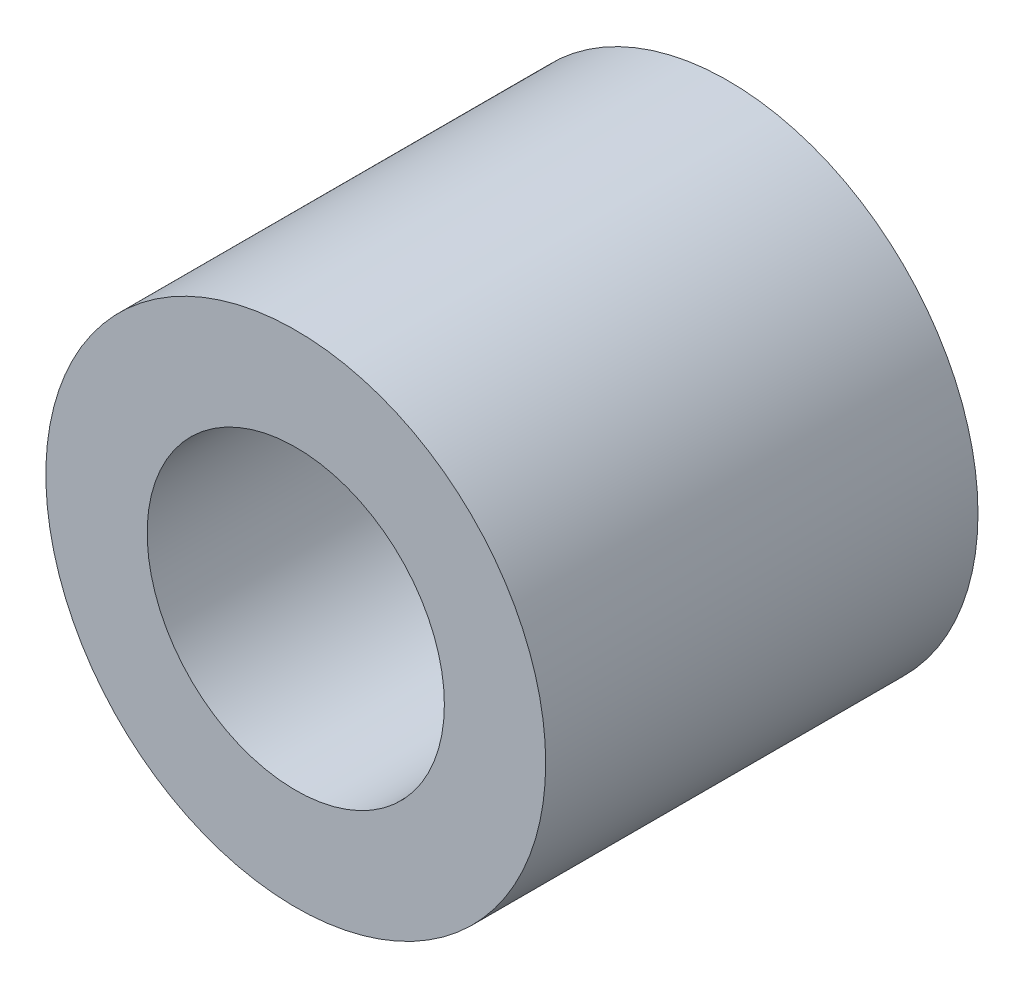
ISO-10303-21;
HEADER;
FILE_DESCRIPTION(('STEP AP214'),'2;1');
FILE_NAME('part.step','',(''),(''),'','','');
FILE_SCHEMA(('AUTOMOTIVE_DESIGN { 1 0 10303 214 1 1 1 1 }'));
ENDSEC;
DATA;
#1=APPLICATION_CONTEXT('core data for automotive mechanical design processes');
#2=APPLICATION_PROTOCOL_DEFINITION('international standard','automotive_design',2000,#1);
#3=PRODUCT_CONTEXT('',#1,'mechanical');
#4=PRODUCT('Part','Part','',(#3));
#5=PRODUCT_RELATED_PRODUCT_CATEGORY('part','',(#4));
#6=PRODUCT_DEFINITION_FORMATION('','',#4);
#7=PRODUCT_DEFINITION_CONTEXT('part definition',#1,'design');
#8=PRODUCT_DEFINITION('design','',#6,#7);
#9=PRODUCT_DEFINITION_SHAPE('','',#8);
#10=(LENGTH_UNIT() NAMED_UNIT(*) SI_UNIT(.MILLI.,.METRE.));
#11=(NAMED_UNIT(*) PLANE_ANGLE_UNIT() SI_UNIT($,.RADIAN.));
#12=(NAMED_UNIT(*) SI_UNIT($,.STERADIAN.) SOLID_ANGLE_UNIT());
#13=UNCERTAINTY_MEASURE_WITH_UNIT(LENGTH_MEASURE(1.E-05),#10,'distance_accuracy_value','');
#14=(GEOMETRIC_REPRESENTATION_CONTEXT(3) GLOBAL_UNCERTAINTY_ASSIGNED_CONTEXT((#13)) GLOBAL_UNIT_ASSIGNED_CONTEXT((#10,
#11,#12)) REPRESENTATION_CONTEXT('',''));
#15=CARTESIAN_POINT('',(0.,0.,0.));
#16=DIRECTION('',(0.,0.,1.));
#17=DIRECTION('',(1.,0.,0.));
#18=AXIS2_PLACEMENT_3D('',#15,#16,#17);
#19=CARTESIAN_POINT('',(0.,0.,16.));
#20=DIRECTION('',(0.,0.,1.));
#21=DIRECTION('',(1.,0.,0.));
#22=AXIS2_PLACEMENT_3D('',#19,#20,#21);
#23=PLANE('',#22);
#24=CARTESIAN_POINT('',(0.,0.,16.));
#25=DIRECTION('',(0.,0.,1.));
#26=DIRECTION('',(1.,0.,0.));
#27=AXIS2_PLACEMENT_3D('',#24,#25,#26);
#28=CIRCLE('',#27,9.25);
#29=CARTESIAN_POINT('',(9.25,0.,16.));
#30=VERTEX_POINT('',#29);
#31=EDGE_CURVE('E10',#30,#30,#28,.T.);
#32=ORIENTED_EDGE('',*,*,#31,.T.);
#33=EDGE_LOOP('',(#32));
#34=FACE_BOUND('',#33,.T.);
#35=CARTESIAN_POINT('',(0.,0.,16.));
#36=DIRECTION('',(0.,0.,1.));
#37=DIRECTION('',(1.,0.,0.));
#38=AXIS2_PLACEMENT_3D('',#35,#36,#37);
#39=CIRCLE('',#38,5.5);
#40=CARTESIAN_POINT('',(5.5,0.,16.));
#41=VERTEX_POINT('',#40);
#42=EDGE_CURVE('E44',#41,#41,#39,.T.);
#43=ORIENTED_EDGE('',*,*,#42,.F.);
#44=EDGE_LOOP('',(#43));
#45=FACE_BOUND('',#44,.T.);
#46=ADVANCED_FACE('F33',(#34,#45),#23,.T.);
#47=CARTESIAN_POINT('',(0.,0.,0.));
#48=DIRECTION('',(0.,0.,1.));
#49=DIRECTION('',(1.,0.,0.));
#50=AXIS2_PLACEMENT_3D('',#47,#48,#49);
#51=PLANE('',#50);
#52=CARTESIAN_POINT('',(0.,0.,0.));
#53=DIRECTION('',(0.,0.,1.));
#54=DIRECTION('',(1.,0.,0.));
#55=AXIS2_PLACEMENT_3D('',#52,#53,#54);
#56=CIRCLE('',#55,9.25);
#57=CARTESIAN_POINT('',(9.25,0.,0.));
#58=VERTEX_POINT('',#57);
#59=EDGE_CURVE('E37',#58,#58,#56,.T.);
#60=ORIENTED_EDGE('',*,*,#59,.F.);
#61=EDGE_LOOP('',(#60));
#62=FACE_BOUND('',#61,.T.);
#63=CARTESIAN_POINT('',(0.,0.,0.));
#64=DIRECTION('',(0.,0.,1.));
#65=DIRECTION('',(1.,0.,0.));
#66=AXIS2_PLACEMENT_3D('',#63,#64,#65);
#67=CIRCLE('',#66,5.5);
#68=CARTESIAN_POINT('',(5.5,0.,0.));
#69=VERTEX_POINT('',#68);
#70=EDGE_CURVE('E46',#69,#69,#67,.T.);
#71=ORIENTED_EDGE('',*,*,#70,.T.);
#72=EDGE_LOOP('',(#71));
#73=FACE_BOUND('',#72,.T.);
#74=ADVANCED_FACE('F56',(#62,#73),#51,.F.);
#75=CARTESIAN_POINT('',(0.,0.,16.));
#76=DIRECTION('',(0.,0.,-1.));
#77=DIRECTION('',(-1.,0.,0.));
#78=AXIS2_PLACEMENT_3D('',#75,#76,#77);
#79=CYLINDRICAL_SURFACE('',#78,9.25);
#80=ORIENTED_EDGE('',*,*,#31,.F.);
#81=EDGE_LOOP('',(#80));
#82=FACE_BOUND('',#81,.T.);
#83=ORIENTED_EDGE('',*,*,#59,.T.);
#84=EDGE_LOOP('',(#83));
#85=FACE_BOUND('',#84,.T.);
#86=ADVANCED_FACE('F35',(#82,#85),#79,.T.);
#87=CARTESIAN_POINT('',(0.,0.,16.));
#88=DIRECTION('',(0.,0.,-1.));
#89=DIRECTION('',(-1.,0.,0.));
#90=AXIS2_PLACEMENT_3D('',#87,#88,#89);
#91=CYLINDRICAL_SURFACE('',#90,5.5);
#92=ORIENTED_EDGE('',*,*,#42,.T.);
#93=EDGE_LOOP('',(#92));
#94=FACE_BOUND('',#93,.T.);
#95=ORIENTED_EDGE('',*,*,#70,.F.);
#96=EDGE_LOOP('',(#95));
#97=FACE_BOUND('',#96,.T.);
#98=ADVANCED_FACE('F52',(#94,#97),#91,.F.);
#99=CLOSED_SHELL('',(#46,#74,#86,#98));
#100=MANIFOLD_SOLID_BREP('B2',#99);
#101=ADVANCED_BREP_SHAPE_REPRESENTATION('',(#18,#100),#14);
#102=SHAPE_DEFINITION_REPRESENTATION(#9,#101);
ENDSEC;
END-ISO-10303-21;
